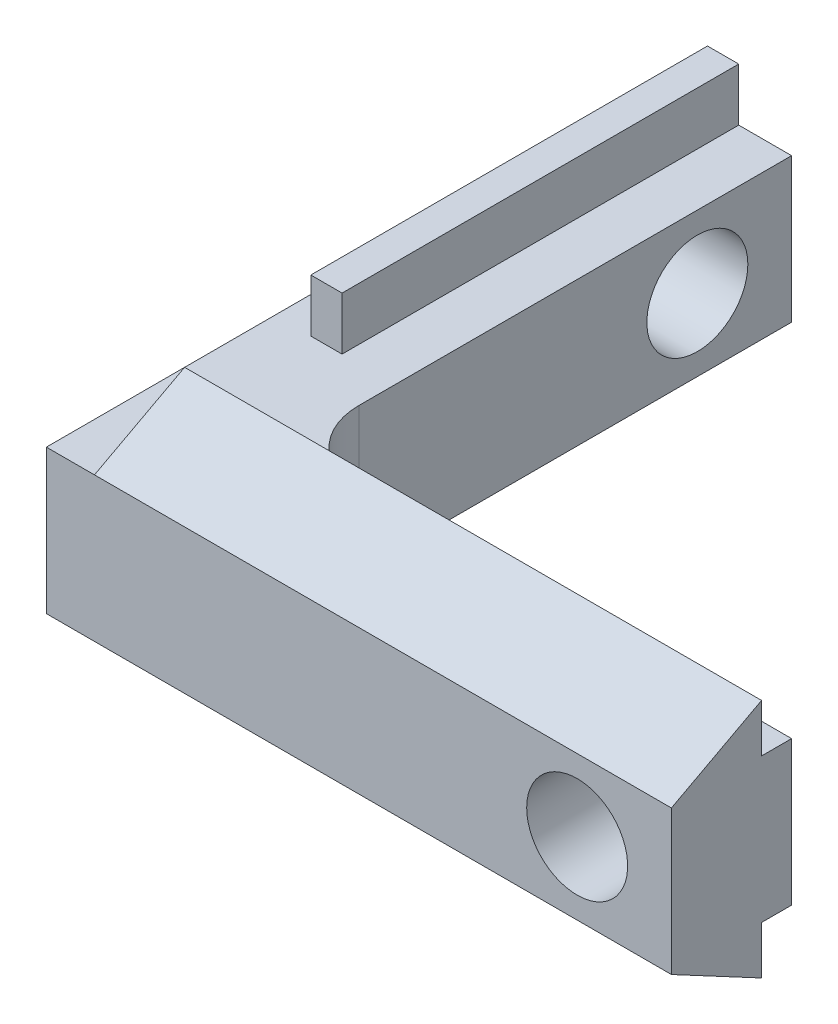
ISO-10303-21;
HEADER;
FILE_DESCRIPTION(('STEP AP214'),'2;1');
FILE_NAME('part.step','',(''),(''),'','','');
FILE_SCHEMA(('AUTOMOTIVE_DESIGN { 1 0 10303 214 1 1 1 1 }'));
ENDSEC;
DATA;
#1=APPLICATION_CONTEXT('core data for automotive mechanical design processes');
#2=APPLICATION_PROTOCOL_DEFINITION('international standard','automotive_design',2000,#1);
#3=PRODUCT_CONTEXT('',#1,'mechanical');
#4=PRODUCT('Part','Part','',(#3));
#5=PRODUCT_RELATED_PRODUCT_CATEGORY('part','',(#4));
#6=PRODUCT_DEFINITION_FORMATION('','',#4);
#7=PRODUCT_DEFINITION_CONTEXT('part definition',#1,'design');
#8=PRODUCT_DEFINITION('design','',#6,#7);
#9=PRODUCT_DEFINITION_SHAPE('','',#8);
#10=(LENGTH_UNIT() NAMED_UNIT(*) SI_UNIT(.MILLI.,.METRE.));
#11=(NAMED_UNIT(*) PLANE_ANGLE_UNIT() SI_UNIT($,.RADIAN.));
#12=(NAMED_UNIT(*) SI_UNIT($,.STERADIAN.) SOLID_ANGLE_UNIT());
#13=UNCERTAINTY_MEASURE_WITH_UNIT(LENGTH_MEASURE(1.E-05),#10,'distance_accuracy_value','');
#14=(GEOMETRIC_REPRESENTATION_CONTEXT(3) GLOBAL_UNCERTAINTY_ASSIGNED_CONTEXT((#13)) GLOBAL_UNIT_ASSIGNED_CONTEXT((#10,
#11,#12)) REPRESENTATION_CONTEXT('',''));
#15=CARTESIAN_POINT('',(0.,0.,0.));
#16=DIRECTION('',(0.,0.,1.));
#17=DIRECTION('',(1.,0.,0.));
#18=AXIS2_PLACEMENT_3D('',#15,#16,#17);
#19=CARTESIAN_POINT('',(0.,6.,0.));
#20=DIRECTION('',(0.,-1.,0.));
#21=DIRECTION('',(0.,0.,-1.));
#22=AXIS2_PLACEMENT_3D('',#19,#20,#21);
#23=PLANE('',#22);
#24=DIRECTION('',(0.,0.,-1.));
#25=VECTOR('',#24,1.);
#26=CARTESIAN_POINT('',(2.,6.,0.));
#27=LINE('',#26,#25);
#28=CARTESIAN_POINT('',(2.,6.,0.));
#29=VERTEX_POINT('',#28);
#30=CARTESIAN_POINT('',(2.,6.,-3.75));
#31=VERTEX_POINT('',#30);
#32=EDGE_CURVE('E420',#29,#31,#27,.T.);
#33=ORIENTED_EDGE('',*,*,#32,.T.);
#34=DIRECTION('',(1.,0.,0.));
#35=VECTOR('',#34,1.);
#36=CARTESIAN_POINT('',(2.,6.,-3.75));
#37=LINE('',#36,#35);
#38=CARTESIAN_POINT('',(26.,6.,-3.75));
#39=VERTEX_POINT('',#38);
#40=EDGE_CURVE('E405',#31,#39,#37,.T.);
#41=ORIENTED_EDGE('',*,*,#40,.T.);
#42=DIRECTION('',(0.,0.,-1.));
#43=VECTOR('',#42,1.);
#44=CARTESIAN_POINT('',(26.,6.,-5.));
#45=LINE('',#44,#43);
#46=CARTESIAN_POINT('',(26.,6.,-5.));
#47=VERTEX_POINT('',#46);
#48=EDGE_CURVE('E281',#39,#47,#45,.T.);
#49=ORIENTED_EDGE('',*,*,#48,.T.);
#50=DIRECTION('',(-1.,0.,0.));
#51=VECTOR('',#50,1.);
#52=CARTESIAN_POINT('',(26.,6.,-5.));
#53=LINE('',#52,#51);
#54=CARTESIAN_POINT('',(8.,6.,-5.));
#55=VERTEX_POINT('',#54);
#56=EDGE_CURVE('E278',#47,#55,#53,.T.);
#57=ORIENTED_EDGE('',*,*,#56,.T.);
#58=CARTESIAN_POINT('',(8.,6.,-8.));
#59=DIRECTION('',(0.,-1.,0.));
#60=DIRECTION('',(0.,0.,-1.));
#61=AXIS2_PLACEMENT_3D('',#58,#59,#60);
#62=CIRCLE('',#61,3.);
#63=CARTESIAN_POINT('',(5.,6.,-8.));
#64=VERTEX_POINT('',#63);
#65=EDGE_CURVE('E11',#55,#64,#62,.T.);
#66=ORIENTED_EDGE('',*,*,#65,.T.);
#67=DIRECTION('',(0.,0.,-1.));
#68=VECTOR('',#67,1.);
#69=CARTESIAN_POINT('',(5.,6.,-5.));
#70=LINE('',#69,#68);
#71=CARTESIAN_POINT('',(5.,6.,-26.));
#72=VERTEX_POINT('',#71);
#73=EDGE_CURVE('E276',#64,#72,#70,.T.);
#74=ORIENTED_EDGE('',*,*,#73,.T.);
#75=DIRECTION('',(-1.,0.,0.));
#76=VECTOR('',#75,1.);
#77=CARTESIAN_POINT('',(5.,6.,-26.));
#78=LINE('',#77,#76);
#79=CARTESIAN_POINT('',(2.8,6.,-26.));
#80=VERTEX_POINT('',#79);
#81=EDGE_CURVE('E272',#72,#80,#78,.T.);
#82=ORIENTED_EDGE('',*,*,#81,.T.);
#83=DIRECTION('',(0.,0.,-1.));
#84=VECTOR('',#83,1.);
#85=CARTESIAN_POINT('',(2.8,6.,-26.));
#86=LINE('',#85,#84);
#87=CARTESIAN_POINT('',(2.8,6.,-9.5));
#88=VERTEX_POINT('',#87);
#89=EDGE_CURVE('E323',#88,#80,#86,.T.);
#90=ORIENTED_EDGE('',*,*,#89,.F.);
#91=DIRECTION('',(1.,0.,0.));
#92=VECTOR('',#91,1.);
#93=CARTESIAN_POINT('',(2.8,6.,-9.5));
#94=LINE('',#93,#92);
#95=CARTESIAN_POINT('',(1.5,6.,-9.5));
#96=VERTEX_POINT('',#95);
#97=EDGE_CURVE('E327',#96,#88,#94,.T.);
#98=ORIENTED_EDGE('',*,*,#97,.F.);
#99=DIRECTION('',(0.,0.,1.));
#100=VECTOR('',#99,1.);
#101=CARTESIAN_POINT('',(1.5,6.,-26.));
#102=LINE('',#101,#100);
#103=CARTESIAN_POINT('',(1.5,6.,-26.));
#104=VERTEX_POINT('',#103);
#105=EDGE_CURVE('E302',#104,#96,#102,.T.);
#106=ORIENTED_EDGE('',*,*,#105,.F.);
#107=CARTESIAN_POINT('',(0.,6.,-26.));
#108=VERTEX_POINT('',#107);
#109=EDGE_CURVE('E274',#104,#108,#78,.T.);
#110=ORIENTED_EDGE('',*,*,#109,.T.);
#111=DIRECTION('',(0.,0.,1.));
#112=VECTOR('',#111,1.);
#113=CARTESIAN_POINT('',(0.,6.,0.));
#114=LINE('',#113,#112);
#115=CARTESIAN_POINT('',(0.,6.,0.));
#116=VERTEX_POINT('',#115);
#117=EDGE_CURVE('E229',#108,#116,#114,.T.);
#118=ORIENTED_EDGE('',*,*,#117,.T.);
#119=DIRECTION('',(1.,0.,0.));
#120=VECTOR('',#119,1.);
#121=CARTESIAN_POINT('',(0.,6.,0.));
#122=LINE('',#121,#120);
#123=EDGE_CURVE('E245',#116,#29,#122,.T.);
#124=ORIENTED_EDGE('',*,*,#123,.T.);
#125=EDGE_LOOP('',(#33,#41,#49,#57,#66,#74,#82,#90,#98,#106,#110,#118,#124));
#126=FACE_BOUND('',#125,.T.);
#127=ADVANCED_FACE('F41',(#126),#23,.F.);
#128=CARTESIAN_POINT('',(0.,6.,0.));
#129=DIRECTION('',(0.,0.,-1.));
#130=DIRECTION('',(-1.,0.,0.));
#131=AXIS2_PLACEMENT_3D('',#128,#129,#130);
#132=PLANE('',#131);
#133=CARTESIAN_POINT('',(22.079,3.,0.));
#134=DIRECTION('',(0.,0.,-1.));
#135=DIRECTION('',(-1.,0.,0.));
#136=AXIS2_PLACEMENT_3D('',#133,#134,#135);
#137=CIRCLE('',#136,2.1);
#138=CARTESIAN_POINT('',(19.979,3.,0.));
#139=VERTEX_POINT('',#138);
#140=EDGE_CURVE('E442',#139,#139,#137,.T.);
#141=ORIENTED_EDGE('',*,*,#140,.T.);
#142=EDGE_LOOP('',(#141));
#143=FACE_BOUND('',#142,.T.);
#144=DIRECTION('',(1.,0.,0.));
#145=VECTOR('',#144,1.);
#146=CARTESIAN_POINT('',(0.,0.,0.));
#147=LINE('',#146,#145);
#148=CARTESIAN_POINT('',(0.,0.,0.));
#149=VERTEX_POINT('',#148);
#150=CARTESIAN_POINT('',(2.,0.,0.));
#151=VERTEX_POINT('',#150);
#152=EDGE_CURVE('E205',#149,#151,#147,.T.);
#153=ORIENTED_EDGE('',*,*,#152,.T.);
#154=DIRECTION('',(1.,0.,0.));
#155=VECTOR('',#154,1.);
#156=CARTESIAN_POINT('',(2.,0.,0.));
#157=LINE('',#156,#155);
#158=CARTESIAN_POINT('',(26.,0.,0.));
#159=VERTEX_POINT('',#158);
#160=EDGE_CURVE('E180',#151,#159,#157,.T.);
#161=ORIENTED_EDGE('',*,*,#160,.T.);
#162=DIRECTION('',(0.,-1.,0.));
#163=VECTOR('',#162,1.);
#164=CARTESIAN_POINT('',(26.,6.,0.));
#165=LINE('',#164,#163);
#166=CARTESIAN_POINT('',(26.,6.,0.));
#167=VERTEX_POINT('',#166);
#168=EDGE_CURVE('E260',#167,#159,#165,.T.);
#169=ORIENTED_EDGE('',*,*,#168,.F.);
#170=DIRECTION('',(1.,0.,0.));
#171=VECTOR('',#170,1.);
#172=CARTESIAN_POINT('',(2.,6.,0.));
#173=LINE('',#172,#171);
#174=EDGE_CURVE('E394',#29,#167,#173,.T.);
#175=ORIENTED_EDGE('',*,*,#174,.F.);
#176=ORIENTED_EDGE('',*,*,#123,.F.);
#177=DIRECTION('',(0.,-1.,0.));
#178=VECTOR('',#177,1.);
#179=CARTESIAN_POINT('',(0.,6.,0.));
#180=LINE('',#179,#178);
#181=EDGE_CURVE('E216',#116,#149,#180,.T.);
#182=ORIENTED_EDGE('',*,*,#181,.T.);
#183=EDGE_LOOP('',(#153,#161,#169,#175,#176,#182));
#184=FACE_BOUND('',#183,.T.);
#185=ADVANCED_FACE('F213',(#143,#184),#132,.F.);
#186=CARTESIAN_POINT('',(26.,6.,-5.));
#187=DIRECTION('',(-1.,0.,0.));
#188=DIRECTION('',(0.,0.,1.));
#189=AXIS2_PLACEMENT_3D('',#186,#187,#188);
#190=PLANE('',#189);
#191=ORIENTED_EDGE('',*,*,#168,.T.);
#192=DIRECTION('',(0.,-0.470588235294118,-0.882352941176471));
#193=VECTOR('',#192,1.);
#194=CARTESIAN_POINT('',(26.,-2.,-3.75));
#195=LINE('',#194,#193);
#196=CARTESIAN_POINT('',(26.,-2.,-3.75));
#197=VERTEX_POINT('',#196);
#198=EDGE_CURVE('E186',#159,#197,#195,.T.);
#199=ORIENTED_EDGE('',*,*,#198,.T.);
#200=DIRECTION('',(0.,1.,0.));
#201=VECTOR('',#200,1.);
#202=CARTESIAN_POINT('',(26.,0.,-3.75));
#203=LINE('',#202,#201);
#204=CARTESIAN_POINT('',(26.,0.,-3.75));
#205=VERTEX_POINT('',#204);
#206=EDGE_CURVE('E210',#197,#205,#203,.T.);
#207=ORIENTED_EDGE('',*,*,#206,.T.);
#208=DIRECTION('',(0.,0.,-1.));
#209=VECTOR('',#208,1.);
#210=CARTESIAN_POINT('',(26.,0.,-5.));
#211=LINE('',#210,#209);
#212=CARTESIAN_POINT('',(26.,0.,-5.));
#213=VERTEX_POINT('',#212);
#214=EDGE_CURVE('E218',#205,#213,#211,.T.);
#215=ORIENTED_EDGE('',*,*,#214,.T.);
#216=DIRECTION('',(0.,-1.,0.));
#217=VECTOR('',#216,1.);
#218=CARTESIAN_POINT('',(26.,6.,-5.));
#219=LINE('',#218,#217);
#220=EDGE_CURVE('E256',#47,#213,#219,.T.);
#221=ORIENTED_EDGE('',*,*,#220,.F.);
#222=ORIENTED_EDGE('',*,*,#48,.F.);
#223=DIRECTION('',(0.,1.,0.));
#224=VECTOR('',#223,1.);
#225=CARTESIAN_POINT('',(26.,6.,-3.75));
#226=LINE('',#225,#224);
#227=CARTESIAN_POINT('',(26.,8.,-3.75));
#228=VERTEX_POINT('',#227);
#229=EDGE_CURVE('E421',#39,#228,#226,.T.);
#230=ORIENTED_EDGE('',*,*,#229,.T.);
#231=DIRECTION('',(0.,-0.470588235294118,0.882352941176471));
#232=VECTOR('',#231,1.);
#233=CARTESIAN_POINT('',(26.,8.,-3.75));
#234=LINE('',#233,#232);
#235=EDGE_CURVE('E416',#228,#167,#234,.T.);
#236=ORIENTED_EDGE('',*,*,#235,.T.);
#237=EDGE_LOOP('',(#191,#199,#207,#215,#221,#222,#230,#236));
#238=FACE_BOUND('',#237,.T.);
#239=ADVANCED_FACE('F476',(#238),#190,.F.);
#240=CARTESIAN_POINT('',(26.,6.,-5.));
#241=DIRECTION('',(0.,0.,1.));
#242=DIRECTION('',(1.,0.,0.));
#243=AXIS2_PLACEMENT_3D('',#240,#241,#242);
#244=PLANE('',#243);
#245=CARTESIAN_POINT('',(22.079,3.,-5.));
#246=DIRECTION('',(0.,0.,-1.));
#247=DIRECTION('',(-1.,0.,0.));
#248=AXIS2_PLACEMENT_3D('',#245,#246,#247);
#249=CIRCLE('',#248,2.1);
#250=CARTESIAN_POINT('',(19.979,3.,-5.));
#251=VERTEX_POINT('',#250);
#252=EDGE_CURVE('E448',#251,#251,#249,.T.);
#253=ORIENTED_EDGE('',*,*,#252,.F.);
#254=EDGE_LOOP('',(#253));
#255=FACE_BOUND('',#254,.T.);
#256=DIRECTION('',(-1.,0.,0.));
#257=VECTOR('',#256,1.);
#258=CARTESIAN_POINT('',(26.,0.,-5.));
#259=LINE('',#258,#257);
#260=CARTESIAN_POINT('',(8.,0.,-5.));
#261=VERTEX_POINT('',#260);
#262=EDGE_CURVE('E223',#213,#261,#259,.T.);
#263=ORIENTED_EDGE('',*,*,#262,.T.);
#264=DIRECTION('',(0.,-1.,0.));
#265=VECTOR('',#264,1.);
#266=CARTESIAN_POINT('',(8.,6.,-5.));
#267=LINE('',#266,#265);
#268=EDGE_CURVE('E58',#261,#55,#267,.F.);
#269=ORIENTED_EDGE('',*,*,#268,.T.);
#270=ORIENTED_EDGE('',*,*,#56,.F.);
#271=ORIENTED_EDGE('',*,*,#220,.T.);
#272=EDGE_LOOP('',(#263,#269,#270,#271));
#273=FACE_BOUND('',#272,.T.);
#274=ADVANCED_FACE('F489',(#255,#273),#244,.F.);
#275=CARTESIAN_POINT('',(5.,6.,-5.));
#276=DIRECTION('',(-1.,0.,0.));
#277=DIRECTION('',(0.,0.,1.));
#278=AXIS2_PLACEMENT_3D('',#275,#276,#277);
#279=PLANE('',#278);
#280=CARTESIAN_POINT('',(5.,3.,-22.079));
#281=DIRECTION('',(1.,0.,0.));
#282=DIRECTION('',(0.,0.,-1.));
#283=AXIS2_PLACEMENT_3D('',#280,#281,#282);
#284=CIRCLE('',#283,2.1);
#285=CARTESIAN_POINT('',(5.,3.,-24.179));
#286=VERTEX_POINT('',#285);
#287=EDGE_CURVE('E452',#286,#286,#284,.T.);
#288=ORIENTED_EDGE('',*,*,#287,.F.);
#289=EDGE_LOOP('',(#288));
#290=FACE_BOUND('',#289,.T.);
#291=ORIENTED_EDGE('',*,*,#73,.F.);
#292=DIRECTION('',(0.,-1.,0.));
#293=VECTOR('',#292,1.);
#294=CARTESIAN_POINT('',(5.,0.,-8.));
#295=LINE('',#294,#293);
#296=CARTESIAN_POINT('',(5.,0.,-8.));
#297=VERTEX_POINT('',#296);
#298=EDGE_CURVE('E263',#64,#297,#295,.T.);
#299=ORIENTED_EDGE('',*,*,#298,.T.);
#300=DIRECTION('',(0.,0.,-1.));
#301=VECTOR('',#300,1.);
#302=CARTESIAN_POINT('',(5.,0.,-5.));
#303=LINE('',#302,#301);
#304=CARTESIAN_POINT('',(5.,0.,-26.));
#305=VERTEX_POINT('',#304);
#306=EDGE_CURVE('E234',#297,#305,#303,.T.);
#307=ORIENTED_EDGE('',*,*,#306,.T.);
#308=DIRECTION('',(0.,-1.,0.));
#309=VECTOR('',#308,1.);
#310=CARTESIAN_POINT('',(5.,6.,-26.));
#311=LINE('',#310,#309);
#312=EDGE_CURVE('E252',#72,#305,#311,.T.);
#313=ORIENTED_EDGE('',*,*,#312,.F.);
#314=EDGE_LOOP('',(#291,#299,#307,#313));
#315=FACE_BOUND('',#314,.T.);
#316=ADVANCED_FACE('F361',(#290,#315),#279,.F.);
#317=CARTESIAN_POINT('',(5.,6.,-26.));
#318=DIRECTION('',(0.,0.,1.));
#319=DIRECTION('',(1.,0.,0.));
#320=AXIS2_PLACEMENT_3D('',#317,#318,#319);
#321=PLANE('',#320);
#322=DIRECTION('',(-1.,0.,0.));
#323=VECTOR('',#322,1.);
#324=CARTESIAN_POINT('',(5.,0.,-26.));
#325=LINE('',#324,#323);
#326=CARTESIAN_POINT('',(2.8,0.,-26.));
#327=VERTEX_POINT('',#326);
#328=EDGE_CURVE('E238',#305,#327,#325,.T.);
#329=ORIENTED_EDGE('',*,*,#328,.T.);
#330=DIRECTION('',(0.,1.,0.));
#331=VECTOR('',#330,1.);
#332=CARTESIAN_POINT('',(2.8,-2.2,-26.));
#333=LINE('',#332,#331);
#334=CARTESIAN_POINT('',(2.8,-2.2,-26.));
#335=VERTEX_POINT('',#334);
#336=EDGE_CURVE('E366',#335,#327,#333,.T.);
#337=ORIENTED_EDGE('',*,*,#336,.F.);
#338=DIRECTION('',(1.,0.,0.));
#339=VECTOR('',#338,1.);
#340=CARTESIAN_POINT('',(1.5,-2.2,-26.));
#341=LINE('',#340,#339);
#342=CARTESIAN_POINT('',(1.5,-2.2,-26.));
#343=VERTEX_POINT('',#342);
#344=EDGE_CURVE('E399',#343,#335,#341,.T.);
#345=ORIENTED_EDGE('',*,*,#344,.F.);
#346=DIRECTION('',(0.,1.,0.));
#347=VECTOR('',#346,1.);
#348=CARTESIAN_POINT('',(1.5,-2.2,-26.));
#349=LINE('',#348,#347);
#350=CARTESIAN_POINT('',(1.5,0.,-26.));
#351=VERTEX_POINT('',#350);
#352=EDGE_CURVE('E295',#343,#351,#349,.T.);
#353=ORIENTED_EDGE('',*,*,#352,.T.);
#354=CARTESIAN_POINT('',(0.,0.,-26.));
#355=VERTEX_POINT('',#354);
#356=EDGE_CURVE('E237',#351,#355,#325,.T.);
#357=ORIENTED_EDGE('',*,*,#356,.T.);
#358=DIRECTION('',(0.,-1.,0.));
#359=VECTOR('',#358,1.);
#360=CARTESIAN_POINT('',(0.,6.,-26.));
#361=LINE('',#360,#359);
#362=EDGE_CURVE('E248',#108,#355,#361,.T.);
#363=ORIENTED_EDGE('',*,*,#362,.F.);
#364=ORIENTED_EDGE('',*,*,#109,.F.);
#365=DIRECTION('',(0.,-1.,0.));
#366=VECTOR('',#365,1.);
#367=CARTESIAN_POINT('',(1.5,8.2,-26.));
#368=LINE('',#367,#366);
#369=CARTESIAN_POINT('',(1.5,8.2,-26.));
#370=VERTEX_POINT('',#369);
#371=EDGE_CURVE('E219',#370,#104,#368,.T.);
#372=ORIENTED_EDGE('',*,*,#371,.F.);
#373=DIRECTION('',(-1.,0.,0.));
#374=VECTOR('',#373,1.);
#375=CARTESIAN_POINT('',(2.8,8.2,-26.));
#376=LINE('',#375,#374);
#377=CARTESIAN_POINT('',(2.8,8.2,-26.));
#378=VERTEX_POINT('',#377);
#379=EDGE_CURVE('E315',#378,#370,#376,.T.);
#380=ORIENTED_EDGE('',*,*,#379,.F.);
#381=DIRECTION('',(0.,-1.,0.));
#382=VECTOR('',#381,1.);
#383=CARTESIAN_POINT('',(2.8,8.2,-26.));
#384=LINE('',#383,#382);
#385=EDGE_CURVE('E336',#378,#80,#384,.T.);
#386=ORIENTED_EDGE('',*,*,#385,.T.);
#387=ORIENTED_EDGE('',*,*,#81,.F.);
#388=ORIENTED_EDGE('',*,*,#312,.T.);
#389=EDGE_LOOP('',(#329,#337,#345,#353,#357,#363,#364,#372,#380,#386,#387,#388));
#390=FACE_BOUND('',#389,.T.);
#391=ADVANCED_FACE('F291',(#390),#321,.F.);
#392=CARTESIAN_POINT('',(0.,6.,0.));
#393=DIRECTION('',(1.,0.,0.));
#394=DIRECTION('',(0.,0.,-1.));
#395=AXIS2_PLACEMENT_3D('',#392,#393,#394);
#396=PLANE('',#395);
#397=CARTESIAN_POINT('',(0.,3.,-22.079));
#398=DIRECTION('',(1.,0.,0.));
#399=DIRECTION('',(0.,0.,-1.));
#400=AXIS2_PLACEMENT_3D('',#397,#398,#399);
#401=CIRCLE('',#400,2.1);
#402=CARTESIAN_POINT('',(0.,3.,-24.179));
#403=VERTEX_POINT('',#402);
#404=EDGE_CURVE('E45',#403,#403,#401,.T.);
#405=ORIENTED_EDGE('',*,*,#404,.T.);
#406=EDGE_LOOP('',(#405));
#407=FACE_BOUND('',#406,.T.);
#408=DIRECTION('',(0.,0.,1.));
#409=VECTOR('',#408,1.);
#410=CARTESIAN_POINT('',(0.,0.,0.));
#411=LINE('',#410,#409);
#412=EDGE_CURVE('E242',#355,#149,#411,.T.);
#413=ORIENTED_EDGE('',*,*,#412,.T.);
#414=ORIENTED_EDGE('',*,*,#181,.F.);
#415=ORIENTED_EDGE('',*,*,#117,.F.);
#416=ORIENTED_EDGE('',*,*,#362,.T.);
#417=EDGE_LOOP('',(#413,#414,#415,#416));
#418=FACE_BOUND('',#417,.T.);
#419=ADVANCED_FACE('F298',(#407,#418),#396,.F.);
#420=CARTESIAN_POINT('',(0.,0.,0.));
#421=DIRECTION('',(0.,-1.,0.));
#422=DIRECTION('',(0.,0.,-1.));
#423=AXIS2_PLACEMENT_3D('',#420,#421,#422);
#424=PLANE('',#423);
#425=DIRECTION('',(1.,0.,0.));
#426=VECTOR('',#425,1.);
#427=CARTESIAN_POINT('',(2.,0.,-3.75));
#428=LINE('',#427,#426);
#429=CARTESIAN_POINT('',(2.,0.,-3.75));
#430=VERTEX_POINT('',#429);
#431=EDGE_CURVE('E208',#430,#205,#428,.T.);
#432=ORIENTED_EDGE('',*,*,#431,.F.);
#433=DIRECTION('',(0.,0.,1.));
#434=VECTOR('',#433,1.);
#435=CARTESIAN_POINT('',(2.,0.,0.));
#436=LINE('',#435,#434);
#437=EDGE_CURVE('E197',#430,#151,#436,.T.);
#438=ORIENTED_EDGE('',*,*,#437,.T.);
#439=ORIENTED_EDGE('',*,*,#152,.F.);
#440=ORIENTED_EDGE('',*,*,#412,.F.);
#441=ORIENTED_EDGE('',*,*,#356,.F.);
#442=DIRECTION('',(0.,0.,-1.));
#443=VECTOR('',#442,1.);
#444=CARTESIAN_POINT('',(1.5,0.,-26.));
#445=LINE('',#444,#443);
#446=CARTESIAN_POINT('',(1.5,0.,-9.5));
#447=VERTEX_POINT('',#446);
#448=EDGE_CURVE('E391',#447,#351,#445,.T.);
#449=ORIENTED_EDGE('',*,*,#448,.F.);
#450=DIRECTION('',(-1.,0.,0.));
#451=VECTOR('',#450,1.);
#452=CARTESIAN_POINT('',(1.5,0.,-9.5));
#453=LINE('',#452,#451);
#454=CARTESIAN_POINT('',(2.8,0.,-9.5));
#455=VERTEX_POINT('',#454);
#456=EDGE_CURVE('E384',#455,#447,#453,.T.);
#457=ORIENTED_EDGE('',*,*,#456,.F.);
#458=DIRECTION('',(0.,0.,1.));
#459=VECTOR('',#458,1.);
#460=CARTESIAN_POINT('',(2.8,0.,-26.));
#461=LINE('',#460,#459);
#462=EDGE_CURVE('E363',#327,#455,#461,.T.);
#463=ORIENTED_EDGE('',*,*,#462,.F.);
#464=ORIENTED_EDGE('',*,*,#328,.F.);
#465=ORIENTED_EDGE('',*,*,#306,.F.);
#466=CARTESIAN_POINT('',(8.,0.,-8.));
#467=DIRECTION('',(0.,-1.,0.));
#468=DIRECTION('',(0.,0.,-1.));
#469=AXIS2_PLACEMENT_3D('',#466,#467,#468);
#470=CIRCLE('',#469,3.);
#471=EDGE_CURVE('E51',#297,#261,#470,.F.);
#472=ORIENTED_EDGE('',*,*,#471,.T.);
#473=ORIENTED_EDGE('',*,*,#262,.F.);
#474=ORIENTED_EDGE('',*,*,#214,.F.);
#475=EDGE_LOOP('',(#432,#438,#439,#440,#441,#449,#457,#463,#464,#465,#472,#473,#474));
#476=FACE_BOUND('',#475,.T.);
#477=ADVANCED_FACE('F203',(#476),#424,.T.);
#478=CARTESIAN_POINT('',(1.5,8.2,-26.));
#479=DIRECTION('',(1.,0.,0.));
#480=DIRECTION('',(0.,0.,-1.));
#481=AXIS2_PLACEMENT_3D('',#478,#479,#480);
#482=PLANE('',#481);
#483=ORIENTED_EDGE('',*,*,#105,.T.);
#484=DIRECTION('',(0.,-1.,0.));
#485=VECTOR('',#484,1.);
#486=CARTESIAN_POINT('',(1.5,8.2,-9.5));
#487=LINE('',#486,#485);
#488=CARTESIAN_POINT('',(1.5,8.2,-9.5));
#489=VERTEX_POINT('',#488);
#490=EDGE_CURVE('E226',#489,#96,#487,.T.);
#491=ORIENTED_EDGE('',*,*,#490,.F.);
#492=DIRECTION('',(0.,0.,1.));
#493=VECTOR('',#492,1.);
#494=CARTESIAN_POINT('',(1.5,8.2,-26.));
#495=LINE('',#494,#493);
#496=EDGE_CURVE('E309',#370,#489,#495,.T.);
#497=ORIENTED_EDGE('',*,*,#496,.F.);
#498=ORIENTED_EDGE('',*,*,#371,.T.);
#499=EDGE_LOOP('',(#483,#491,#497,#498));
#500=FACE_BOUND('',#499,.T.);
#501=ADVANCED_FACE('F306',(#500),#482,.F.);
#502=CARTESIAN_POINT('',(2.8,8.2,-9.5));
#503=DIRECTION('',(0.,0.,-1.));
#504=DIRECTION('',(-1.,0.,0.));
#505=AXIS2_PLACEMENT_3D('',#502,#503,#504);
#506=PLANE('',#505);
#507=ORIENTED_EDGE('',*,*,#97,.T.);
#508=DIRECTION('',(0.,-1.,0.));
#509=VECTOR('',#508,1.);
#510=CARTESIAN_POINT('',(2.8,8.2,-9.5));
#511=LINE('',#510,#509);
#512=CARTESIAN_POINT('',(2.8,8.2,-9.5));
#513=VERTEX_POINT('',#512);
#514=EDGE_CURVE('E344',#513,#88,#511,.T.);
#515=ORIENTED_EDGE('',*,*,#514,.F.);
#516=DIRECTION('',(1.,0.,0.));
#517=VECTOR('',#516,1.);
#518=CARTESIAN_POINT('',(2.8,8.2,-9.5));
#519=LINE('',#518,#517);
#520=EDGE_CURVE('E314',#489,#513,#519,.T.);
#521=ORIENTED_EDGE('',*,*,#520,.F.);
#522=ORIENTED_EDGE('',*,*,#490,.T.);
#523=EDGE_LOOP('',(#507,#515,#521,#522));
#524=FACE_BOUND('',#523,.T.);
#525=ADVANCED_FACE('F350',(#524),#506,.F.);
#526=CARTESIAN_POINT('',(2.8,8.2,-26.));
#527=DIRECTION('',(-1.,0.,0.));
#528=DIRECTION('',(0.,0.,1.));
#529=AXIS2_PLACEMENT_3D('',#526,#527,#528);
#530=PLANE('',#529);
#531=ORIENTED_EDGE('',*,*,#89,.T.);
#532=ORIENTED_EDGE('',*,*,#385,.F.);
#533=DIRECTION('',(0.,0.,-1.));
#534=VECTOR('',#533,1.);
#535=CARTESIAN_POINT('',(2.8,8.2,-26.));
#536=LINE('',#535,#534);
#537=EDGE_CURVE('E319',#513,#378,#536,.T.);
#538=ORIENTED_EDGE('',*,*,#537,.F.);
#539=ORIENTED_EDGE('',*,*,#514,.T.);
#540=EDGE_LOOP('',(#531,#532,#538,#539));
#541=FACE_BOUND('',#540,.T.);
#542=ADVANCED_FACE('F353',(#541),#530,.F.);
#543=CARTESIAN_POINT('',(0.,8.2,0.));
#544=DIRECTION('',(0.,1.,0.));
#545=DIRECTION('',(0.,0.,1.));
#546=AXIS2_PLACEMENT_3D('',#543,#544,#545);
#547=PLANE('',#546);
#548=ORIENTED_EDGE('',*,*,#379,.T.);
#549=ORIENTED_EDGE('',*,*,#496,.T.);
#550=ORIENTED_EDGE('',*,*,#520,.T.);
#551=ORIENTED_EDGE('',*,*,#537,.T.);
#552=EDGE_LOOP('',(#548,#549,#550,#551));
#553=FACE_BOUND('',#552,.T.);
#554=ADVANCED_FACE('F317',(#553),#547,.T.);
#555=CARTESIAN_POINT('',(1.5,-2.2,-26.));
#556=DIRECTION('',(1.,0.,0.));
#557=DIRECTION('',(0.,0.,-1.));
#558=AXIS2_PLACEMENT_3D('',#555,#556,#557);
#559=PLANE('',#558);
#560=ORIENTED_EDGE('',*,*,#448,.T.);
#561=ORIENTED_EDGE('',*,*,#352,.F.);
#562=DIRECTION('',(0.,0.,-1.));
#563=VECTOR('',#562,1.);
#564=CARTESIAN_POINT('',(1.5,-2.2,-26.));
#565=LINE('',#564,#563);
#566=CARTESIAN_POINT('',(1.5,-2.2,-9.5));
#567=VERTEX_POINT('',#566);
#568=EDGE_CURVE('E388',#567,#343,#565,.T.);
#569=ORIENTED_EDGE('',*,*,#568,.F.);
#570=DIRECTION('',(0.,1.,0.));
#571=VECTOR('',#570,1.);
#572=CARTESIAN_POINT('',(1.5,-2.2,-9.5));
#573=LINE('',#572,#571);
#574=EDGE_CURVE('E377',#567,#447,#573,.T.);
#575=ORIENTED_EDGE('',*,*,#574,.T.);
#576=EDGE_LOOP('',(#560,#561,#569,#575));
#577=FACE_BOUND('',#576,.T.);
#578=ADVANCED_FACE('F542',(#577),#559,.F.);
#579=CARTESIAN_POINT('',(2.8,-2.2,-26.));
#580=DIRECTION('',(-1.,0.,0.));
#581=DIRECTION('',(0.,0.,1.));
#582=AXIS2_PLACEMENT_3D('',#579,#580,#581);
#583=PLANE('',#582);
#584=ORIENTED_EDGE('',*,*,#462,.T.);
#585=DIRECTION('',(0.,1.,0.));
#586=VECTOR('',#585,1.);
#587=CARTESIAN_POINT('',(2.8,-2.2,-9.5));
#588=LINE('',#587,#586);
#589=CARTESIAN_POINT('',(2.8,-2.2,-9.5));
#590=VERTEX_POINT('',#589);
#591=EDGE_CURVE('E374',#590,#455,#588,.T.);
#592=ORIENTED_EDGE('',*,*,#591,.F.);
#593=DIRECTION('',(0.,0.,1.));
#594=VECTOR('',#593,1.);
#595=CARTESIAN_POINT('',(2.8,-2.2,-26.));
#596=LINE('',#595,#594);
#597=EDGE_CURVE('E372',#335,#590,#596,.T.);
#598=ORIENTED_EDGE('',*,*,#597,.F.);
#599=ORIENTED_EDGE('',*,*,#336,.T.);
#600=EDGE_LOOP('',(#584,#592,#598,#599));
#601=FACE_BOUND('',#600,.T.);
#602=ADVANCED_FACE('F369',(#601),#583,.F.);
#603=CARTESIAN_POINT('',(1.5,-2.2,-9.5));
#604=DIRECTION('',(0.,0.,-1.));
#605=DIRECTION('',(-1.,0.,0.));
#606=AXIS2_PLACEMENT_3D('',#603,#604,#605);
#607=PLANE('',#606);
#608=ORIENTED_EDGE('',*,*,#456,.T.);
#609=ORIENTED_EDGE('',*,*,#574,.F.);
#610=DIRECTION('',(-1.,0.,0.));
#611=VECTOR('',#610,1.);
#612=CARTESIAN_POINT('',(1.5,-2.2,-9.5));
#613=LINE('',#612,#611);
#614=EDGE_CURVE('E383',#590,#567,#613,.T.);
#615=ORIENTED_EDGE('',*,*,#614,.F.);
#616=ORIENTED_EDGE('',*,*,#591,.T.);
#617=EDGE_LOOP('',(#608,#609,#615,#616));
#618=FACE_BOUND('',#617,.T.);
#619=ADVANCED_FACE('F535',(#618),#607,.F.);
#620=CARTESIAN_POINT('',(0.,-2.2,0.));
#621=DIRECTION('',(0.,1.,0.));
#622=DIRECTION('',(0.,0.,1.));
#623=AXIS2_PLACEMENT_3D('',#620,#621,#622);
#624=PLANE('',#623);
#625=ORIENTED_EDGE('',*,*,#568,.T.);
#626=ORIENTED_EDGE('',*,*,#344,.T.);
#627=ORIENTED_EDGE('',*,*,#597,.T.);
#628=ORIENTED_EDGE('',*,*,#614,.T.);
#629=EDGE_LOOP('',(#625,#626,#627,#628));
#630=FACE_BOUND('',#629,.T.);
#631=ADVANCED_FACE('F530',(#630),#624,.F.);
#632=CARTESIAN_POINT('',(2.,8.,-3.75));
#633=DIRECTION('',(0.,0.88235294117647,0.470588235294118));
#634=DIRECTION('',(0.,-0.470588235294118,0.882352941176471));
#635=AXIS2_PLACEMENT_3D('',#632,#633,#634);
#636=PLANE('',#635);
#637=ORIENTED_EDGE('',*,*,#235,.F.);
#638=DIRECTION('',(1.,0.,0.));
#639=VECTOR('',#638,1.);
#640=CARTESIAN_POINT('',(2.,8.,-3.75));
#641=LINE('',#640,#639);
#642=CARTESIAN_POINT('',(2.,8.,-3.75));
#643=VERTEX_POINT('',#642);
#644=EDGE_CURVE('E409',#643,#228,#641,.T.);
#645=ORIENTED_EDGE('',*,*,#644,.F.);
#646=DIRECTION('',(0.,-0.470588235294118,0.882352941176471));
#647=VECTOR('',#646,1.);
#648=CARTESIAN_POINT('',(2.,8.,-3.75));
#649=LINE('',#648,#647);
#650=EDGE_CURVE('E410',#643,#29,#649,.T.);
#651=ORIENTED_EDGE('',*,*,#650,.T.);
#652=ORIENTED_EDGE('',*,*,#174,.T.);
#653=EDGE_LOOP('',(#637,#645,#651,#652));
#654=FACE_BOUND('',#653,.T.);
#655=ADVANCED_FACE('F501',(#654),#636,.T.);
#656=CARTESIAN_POINT('',(2.,6.,-3.75));
#657=DIRECTION('',(0.,0.,-1.));
#658=DIRECTION('',(-1.,0.,0.));
#659=AXIS2_PLACEMENT_3D('',#656,#657,#658);
#660=PLANE('',#659);
#661=ORIENTED_EDGE('',*,*,#229,.F.);
#662=ORIENTED_EDGE('',*,*,#40,.F.);
#663=DIRECTION('',(0.,1.,0.));
#664=VECTOR('',#663,1.);
#665=CARTESIAN_POINT('',(2.,6.,-3.75));
#666=LINE('',#665,#664);
#667=EDGE_CURVE('E428',#31,#643,#666,.T.);
#668=ORIENTED_EDGE('',*,*,#667,.T.);
#669=ORIENTED_EDGE('',*,*,#644,.T.);
#670=EDGE_LOOP('',(#661,#662,#668,#669));
#671=FACE_BOUND('',#670,.T.);
#672=ADVANCED_FACE('F509',(#671),#660,.T.);
#673=CARTESIAN_POINT('',(2.,0.,0.));
#674=DIRECTION('',(1.,0.,0.));
#675=DIRECTION('',(0.,0.,-1.));
#676=AXIS2_PLACEMENT_3D('',#673,#674,#675);
#677=PLANE('',#676);
#678=ORIENTED_EDGE('',*,*,#32,.F.);
#679=ORIENTED_EDGE('',*,*,#650,.F.);
#680=ORIENTED_EDGE('',*,*,#667,.F.);
#681=EDGE_LOOP('',(#678,#679,#680));
#682=FACE_BOUND('',#681,.T.);
#683=ADVANCED_FACE('F505',(#682),#677,.F.);
#684=CARTESIAN_POINT('',(2.,0.,-3.75));
#685=DIRECTION('',(0.,0.,-1.));
#686=DIRECTION('',(0.,1.,0.));
#687=AXIS2_PLACEMENT_3D('',#684,#685,#686);
#688=PLANE('',#687);
#689=ORIENTED_EDGE('',*,*,#206,.F.);
#690=DIRECTION('',(1.,0.,0.));
#691=VECTOR('',#690,1.);
#692=CARTESIAN_POINT('',(2.,-2.,-3.75));
#693=LINE('',#692,#691);
#694=CARTESIAN_POINT('',(2.,-2.,-3.75));
#695=VERTEX_POINT('',#694);
#696=EDGE_CURVE('E191',#695,#197,#693,.T.);
#697=ORIENTED_EDGE('',*,*,#696,.F.);
#698=DIRECTION('',(0.,1.,0.));
#699=VECTOR('',#698,1.);
#700=CARTESIAN_POINT('',(2.,0.,-3.75));
#701=LINE('',#700,#699);
#702=EDGE_CURVE('E192',#695,#430,#701,.T.);
#703=ORIENTED_EDGE('',*,*,#702,.T.);
#704=ORIENTED_EDGE('',*,*,#431,.T.);
#705=EDGE_LOOP('',(#689,#697,#703,#704));
#706=FACE_BOUND('',#705,.T.);
#707=ADVANCED_FACE('F520',(#706),#688,.T.);
#708=CARTESIAN_POINT('',(2.,-2.,-3.75));
#709=DIRECTION('',(0.,-0.88235294117647,0.470588235294118));
#710=DIRECTION('',(0.,-0.470588235294118,-0.882352941176471));
#711=AXIS2_PLACEMENT_3D('',#708,#709,#710);
#712=PLANE('',#711);
#713=ORIENTED_EDGE('',*,*,#198,.F.);
#714=ORIENTED_EDGE('',*,*,#160,.F.);
#715=DIRECTION('',(0.,-0.470588235294118,-0.882352941176471));
#716=VECTOR('',#715,1.);
#717=CARTESIAN_POINT('',(2.,-2.,-3.75));
#718=LINE('',#717,#716);
#719=EDGE_CURVE('E183',#151,#695,#718,.T.);
#720=ORIENTED_EDGE('',*,*,#719,.T.);
#721=ORIENTED_EDGE('',*,*,#696,.T.);
#722=EDGE_LOOP('',(#713,#714,#720,#721));
#723=FACE_BOUND('',#722,.T.);
#724=ADVANCED_FACE('F182',(#723),#712,.T.);
#725=CARTESIAN_POINT('',(2.,0.,0.));
#726=DIRECTION('',(-1.,0.,0.));
#727=DIRECTION('',(0.,0.,1.));
#728=AXIS2_PLACEMENT_3D('',#725,#726,#727);
#729=PLANE('',#728);
#730=ORIENTED_EDGE('',*,*,#437,.F.);
#731=ORIENTED_EDGE('',*,*,#702,.F.);
#732=ORIENTED_EDGE('',*,*,#719,.F.);
#733=EDGE_LOOP('',(#730,#731,#732));
#734=FACE_BOUND('',#733,.T.);
#735=ADVANCED_FACE('F196',(#734),#729,.T.);
#736=CARTESIAN_POINT('',(8.,6.,-8.));
#737=DIRECTION('',(0.,1.,0.));
#738=DIRECTION('',(0.,0.,1.));
#739=AXIS2_PLACEMENT_3D('',#736,#737,#738);
#740=CYLINDRICAL_SURFACE('',#739,3.);
#741=ORIENTED_EDGE('',*,*,#65,.F.);
#742=ORIENTED_EDGE('',*,*,#268,.F.);
#743=ORIENTED_EDGE('',*,*,#471,.F.);
#744=ORIENTED_EDGE('',*,*,#298,.F.);
#745=EDGE_LOOP('',(#741,#742,#743,#744));
#746=FACE_BOUND('',#745,.T.);
#747=ADVANCED_FACE('F43',(#746),#740,.F.);
#748=CARTESIAN_POINT('',(22.079,3.,19.));
#749=DIRECTION('',(0.,0.,-1.));
#750=DIRECTION('',(-1.,0.,0.));
#751=AXIS2_PLACEMENT_3D('',#748,#749,#750);
#752=CYLINDRICAL_SURFACE('',#751,2.1);
#753=ORIENTED_EDGE('',*,*,#252,.T.);
#754=EDGE_LOOP('',(#753));
#755=FACE_BOUND('',#754,.T.);
#756=ORIENTED_EDGE('',*,*,#140,.F.);
#757=EDGE_LOOP('',(#756));
#758=FACE_BOUND('',#757,.T.);
#759=ADVANCED_FACE('F464',(#755,#758),#752,.F.);
#760=CARTESIAN_POINT('',(-19.,3.,-22.079));
#761=DIRECTION('',(1.,0.,0.));
#762=DIRECTION('',(0.,0.,-1.));
#763=AXIS2_PLACEMENT_3D('',#760,#761,#762);
#764=CYLINDRICAL_SURFACE('',#763,2.1);
#765=ORIENTED_EDGE('',*,*,#287,.T.);
#766=EDGE_LOOP('',(#765));
#767=FACE_BOUND('',#766,.T.);
#768=ORIENTED_EDGE('',*,*,#404,.F.);
#769=EDGE_LOOP('',(#768));
#770=FACE_BOUND('',#769,.T.);
#771=ADVANCED_FACE('F462',(#767,#770),#764,.F.);
#772=CLOSED_SHELL('',(#127,#185,#239,#274,#316,#391,#419,#477,#501,#525,#542,#554,#578,#602,
#619,#631,#655,#672,#683,#707,#724,#735,#747,#759,#771));
#773=MANIFOLD_SOLID_BREP('B2',#772);
#774=ADVANCED_BREP_SHAPE_REPRESENTATION('',(#18,#773),#14);
#775=SHAPE_DEFINITION_REPRESENTATION(#9,#774);
ENDSEC;
END-ISO-10303-21;
